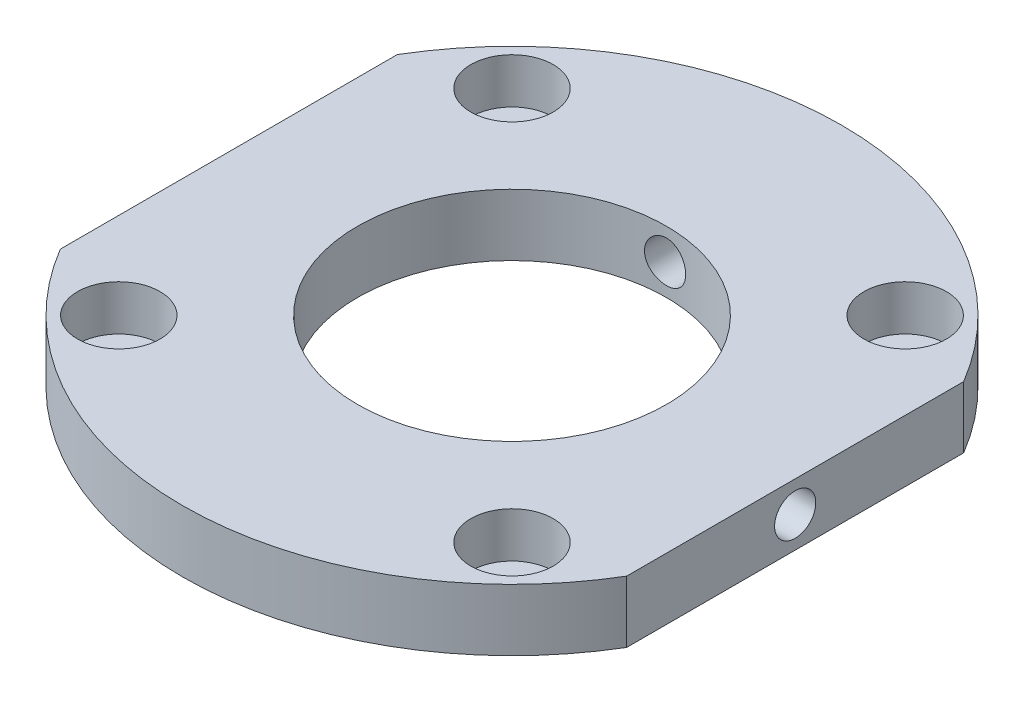
ISO-10303-21;
HEADER;
FILE_DESCRIPTION(('STEP AP214'),'2;1');
FILE_NAME('part.step','',(''),(''),'','','');
FILE_SCHEMA(('AUTOMOTIVE_DESIGN { 1 0 10303 214 1 1 1 1 }'));
ENDSEC;
DATA;
#1=APPLICATION_CONTEXT('core data for automotive mechanical design processes');
#2=APPLICATION_PROTOCOL_DEFINITION('international standard','automotive_design',2000,#1);
#3=PRODUCT_CONTEXT('',#1,'mechanical');
#4=PRODUCT('Part','Part','',(#3));
#5=PRODUCT_RELATED_PRODUCT_CATEGORY('part','',(#4));
#6=PRODUCT_DEFINITION_FORMATION('','',#4);
#7=PRODUCT_DEFINITION_CONTEXT('part definition',#1,'design');
#8=PRODUCT_DEFINITION('design','',#6,#7);
#9=PRODUCT_DEFINITION_SHAPE('','',#8);
#10=(LENGTH_UNIT() NAMED_UNIT(*) SI_UNIT(.MILLI.,.METRE.));
#11=(NAMED_UNIT(*) PLANE_ANGLE_UNIT() SI_UNIT($,.RADIAN.));
#12=(NAMED_UNIT(*) SI_UNIT($,.STERADIAN.) SOLID_ANGLE_UNIT());
#13=UNCERTAINTY_MEASURE_WITH_UNIT(LENGTH_MEASURE(1.E-05),#10,'distance_accuracy_value','');
#14=(GEOMETRIC_REPRESENTATION_CONTEXT(3) GLOBAL_UNCERTAINTY_ASSIGNED_CONTEXT((#13)) GLOBAL_UNIT_ASSIGNED_CONTEXT((#10,
#11,#12)) REPRESENTATION_CONTEXT('',''));
#15=CARTESIAN_POINT('',(0.,0.,0.));
#16=DIRECTION('',(0.,0.,1.));
#17=DIRECTION('',(1.,0.,0.));
#18=AXIS2_PLACEMENT_3D('',#15,#16,#17);
#19=CARTESIAN_POINT('',(0.,6.,0.));
#20=DIRECTION('',(0.,-1.,0.));
#21=DIRECTION('',(0.,0.,-1.));
#22=AXIS2_PLACEMENT_3D('',#19,#20,#21);
#23=CYLINDRICAL_SURFACE('',#22,32.);
#24=CARTESIAN_POINT('',(0.,5.,-32.));
#25=CARTESIAN_POINT('',(-0.112223346836729,4.99999506217715,-31.9999991691436));
#26=CARTESIAN_POINT('',(-0.224525271712995,4.99052270052992,-31.9994033390944));
#27=CARTESIAN_POINT('',(-0.446028210718385,4.95287153229503,-31.9970837372355));
#28=CARTESIAN_POINT('',(-0.555225461224794,4.92467095309709,-31.995358652637));
#29=CARTESIAN_POINT('',(-0.76727850818779,4.85037649827136,-31.9909756950359));
#30=CARTESIAN_POINT('',(-0.870137616661279,4.80429206138817,-31.9883183141517));
#31=CARTESIAN_POINT('',(-1.06663341580873,4.69555335911499,-31.9823696449571));
#32=CARTESIAN_POINT('',(-1.16027221185357,4.63290288851908,-31.97907850187));
#33=CARTESIAN_POINT('',(-1.33583645868492,4.49270769581982,-31.9722267354338));
#34=CARTESIAN_POINT('',(-1.41774628048157,4.41514341727255,-31.9686657620133));
#35=CARTESIAN_POINT('',(-1.56739381033953,4.2473626650146,-31.9616786657649));
#36=CARTESIAN_POINT('',(-1.63513092619535,4.15714566287376,-31.9582525485769));
#37=CARTESIAN_POINT('',(-1.75455837247395,3.96653191769914,-31.9519188366027));
#38=CARTESIAN_POINT('',(-1.80623572151365,3.8661270261233,-31.9490116620903));
#39=CARTESIAN_POINT('',(-1.89199363600726,3.65804475526381,-31.9440482085556));
#40=CARTESIAN_POINT('',(-1.92607439070512,3.55036745420595,-31.9419919203822));
#41=CARTESIAN_POINT('',(-1.97562831743006,3.33094747213823,-31.9389654609923));
#42=CARTESIAN_POINT('',(-1.99112596908517,3.21921033964478,-31.9379938610264));
#43=CARTESIAN_POINT('',(-2.0031493359497,2.99471672174316,-31.9372420665942));
#44=CARTESIAN_POINT('',(-1.99967526602792,2.88196024789422,-31.9374618586344));
#45=CARTESIAN_POINT('',(-1.97387412170284,2.65879549518035,-31.9390667357904));
#46=CARTESIAN_POINT('',(-1.95157353844043,2.5483841401366,-31.9404501834944));
#47=CARTESIAN_POINT('',(-1.88879348852425,2.33287500595443,-31.9442238871793));
#48=CARTESIAN_POINT('',(-1.84831391294731,2.22777725865777,-31.9466141491928));
#49=CARTESIAN_POINT('',(-1.75029487225467,2.02579357945255,-31.9521339981319));
#50=CARTESIAN_POINT('',(-1.6927433900599,1.92891349401527,-31.9552641055254));
#51=CARTESIAN_POINT('',(-1.56222292166933,1.74617912943944,-31.9619103808454));
#52=CARTESIAN_POINT('',(-1.48925376214584,1.6603249742734,-31.9654265531119));
#53=CARTESIAN_POINT('',(-1.32982006299893,1.50192542352285,-31.9724559793486));
#54=CARTESIAN_POINT('',(-1.24333259667533,1.42940310163137,-31.9759692179758));
#55=CARTESIAN_POINT('',(-1.05939772122561,1.29990383985337,-31.982591062014));
#56=CARTESIAN_POINT('',(-0.961950308270381,1.24292690539803,-31.9856996672838));
#57=CARTESIAN_POINT('',(-0.758847722758267,1.14613773981916,-31.9911621980439));
#58=CARTESIAN_POINT('',(-0.65319213264681,1.10632638259385,-31.99351608511));
#59=CARTESIAN_POINT('',(-0.436678621420558,1.04501388453335,-31.9972034118695));
#60=CARTESIAN_POINT('',(-0.325820761078034,1.02351252985915,-31.9985368634802));
#61=CARTESIAN_POINT('',(-0.102249754998165,0.999458972764364,-32.0000315242478));
#62=CARTESIAN_POINT('',(0.0104599459167998,0.996874868906477,-32.0001947068988));
#63=CARTESIAN_POINT('',(0.234711212096938,1.01064581326616,-31.9993356906232));
#64=CARTESIAN_POINT('',(0.346252783437985,1.02700076292529,-31.9983134978653));
#65=CARTESIAN_POINT('',(0.56491166220611,1.07815914272686,-31.9952000745992));
#66=CARTESIAN_POINT('',(0.672032407107905,1.1129479365225,-31.9931096922732));
#67=CARTESIAN_POINT('',(0.878914962577338,1.19997161189095,-31.9880950655264));
#68=CARTESIAN_POINT('',(0.978676706947324,1.25220665037752,-31.9851708136059));
#69=CARTESIAN_POINT('',(1.16815547641269,1.37272126166581,-31.9788121113869));
#70=CARTESIAN_POINT('',(1.25785892714608,1.44102214056318,-31.9753769858254));
#71=CARTESIAN_POINT('',(1.4245381064233,1.59169860828726,-31.9683853852037));
#72=CARTESIAN_POINT('',(1.5015137096365,1.67407433569224,-31.964828908949));
#73=CARTESIAN_POINT('',(1.64066020097159,1.85069978791836,-31.9579897332692));
#74=CARTESIAN_POINT('',(1.70281039277817,1.94496583442934,-31.9547074206804));
#75=CARTESIAN_POINT('',(1.81040027298452,2.14261401874783,-31.9487928812005));
#76=CARTESIAN_POINT('',(1.85584006443136,2.24599610033514,-31.9461606503005));
#77=CARTESIAN_POINT('',(1.92868343817412,2.45886612127191,-31.9418459068394));
#78=CARTESIAN_POINT('',(1.95610004685244,2.56834958857983,-31.9401627084838));
#79=CARTESIAN_POINT('',(1.99216134169379,2.79037667289578,-31.9379339446621));
#80=CARTESIAN_POINT('',(2.00080621416729,2.90292025952074,-31.937388367905));
#81=CARTESIAN_POINT('',(1.99907684048124,3.12766708327775,-31.9374966460887));
#82=CARTESIAN_POINT('',(1.98873513251053,3.23987057322256,-31.9381484490252));
#83=CARTESIAN_POINT('',(1.9493936205426,3.46094461238382,-31.9405736886462));
#84=CARTESIAN_POINT('',(1.92039378273976,3.56981515556111,-31.9423471273629));
#85=CARTESIAN_POINT('',(1.84456652625291,3.78113779391818,-31.946815285928));
#86=CARTESIAN_POINT('',(1.79773923559249,3.88358993518402,-31.9495099991605));
#87=CARTESIAN_POINT('',(1.68759082343583,4.07918218089061,-31.9555169893406));
#88=CARTESIAN_POINT('',(1.62427012917213,4.17232252645054,-31.9588292502911));
#89=CARTESIAN_POINT('',(1.48281211963383,4.34681223237425,-31.9657046929993));
#90=CARTESIAN_POINT('',(1.40465129170038,4.42814251505538,-31.9692682672274));
#91=CARTESIAN_POINT('',(1.23576309808775,4.57655578094688,-31.976241440984));
#92=CARTESIAN_POINT('',(1.14503266246553,4.64363527343915,-31.9796510026267));
#93=CARTESIAN_POINT('',(0.95347744973205,4.76169222059214,-31.9859354897034));
#94=CARTESIAN_POINT('',(0.852640322525288,4.81264965071681,-31.9888097484528));
#95=CARTESIAN_POINT('',(0.643897015514739,4.89684843464142,-31.9936907974328));
#96=CARTESIAN_POINT('',(0.535999282102363,4.93011053697395,-31.9956986030929));
#97=CARTESIAN_POINT('',(0.356201216456018,4.96932944872111,-31.9980943626532));
#98=CARTESIAN_POINT('',(0.2854630794237,4.98081603299553,-31.9988058007412));
#99=CARTESIAN_POINT('',(0.143160621752727,4.99615287847334,-31.9997588841249));
#100=CARTESIAN_POINT('',(0.0715963022564653,5.00000315023449,-32.0000005300701));
#101=CARTESIAN_POINT('',(0.,5.,-32.));
#102=B_SPLINE_CURVE_WITH_KNOTS('',3,(#24,#25,#26,#27,#28,#29,#30,#31,#32,#33,#34,#35,#36,#37,
#38,#39,#40,#41,#42,#43,#44,#45,#46,#47,#48,#49,#50,#51,#52,#53,#54,#55,#56,#57,#58,#59,#60,#61,
#62,#63,#64,#65,#66,#67,#68,#69,#70,#71,#72,#73,#74,#75,#76,#77,#78,#79,#80,#81,#82,#83,#84,#85,
#86,#87,#88,#89,#90,#91,#92,#93,#94,#95,#96,#97,#98,#99,#100,#101),.UNSPECIFIED.,.T.,.F.,(4,2,2,
2,2,2,2,2,2,2,2,2,2,2,2,2,2,2,2,2,2,2,2,2,2,2,2,2,2,2,2,2,2,2,2,2,2,2,4),(0.,0.336408671473624,
0.673209123258165,1.00983205968328,1.34637795233539,1.68336820424855,2.02037253446431,
2.35764856671476,2.6949209716279,3.03174859585641,3.36857240527032,3.70492305202053,
4.04127571411158,4.37786570218283,4.71445947444747,5.05163042223775,5.38880148782714,
5.72598971674317,6.06317400764855,6.39978955065089,6.73640334192087,7.07275026373908,
7.40910021078634,7.7458987565046,8.08270061846787,8.41996994064655,8.75723718297113,
9.09426039422936,9.43128026049925,9.76772309914687,10.1041665473784,10.4406075795674,
10.7770398977113,11.1140097747179,11.451062097263,11.7885314296162,12.1256041876343,
12.3402266427971,12.5548488012287),.UNSPECIFIED.);
#103=CARTESIAN_POINT('',(0.,5.,-32.));
#104=VERTEX_POINT('',#103);
#105=EDGE_CURVE('E130',#104,#104,#102,.T.);
#106=ORIENTED_EDGE('',*,*,#105,.T.);
#107=EDGE_LOOP('',(#106));
#108=FACE_BOUND('',#107,.T.);
#109=CARTESIAN_POINT('',(0.,6.,0.));
#110=DIRECTION('',(0.,1.,0.));
#111=DIRECTION('',(0.,0.,1.));
#112=AXIS2_PLACEMENT_3D('',#109,#110,#111);
#113=CIRCLE('',#112,32.);
#114=CARTESIAN_POINT('',(27.5,6.,-16.3630681719536));
#115=VERTEX_POINT('',#114);
#116=CARTESIAN_POINT('',(-27.5,6.,-16.3630681719536));
#117=VERTEX_POINT('',#116);
#118=EDGE_CURVE('E43',#115,#117,#113,.T.);
#119=ORIENTED_EDGE('',*,*,#118,.F.);
#120=DIRECTION('',(0.,1.,0.));
#121=VECTOR('',#120,1.);
#122=CARTESIAN_POINT('',(27.5,-4.,-16.3630681719536));
#123=LINE('',#122,#121);
#124=CARTESIAN_POINT('',(27.5,0.,-16.3630681719536));
#125=VERTEX_POINT('',#124);
#126=EDGE_CURVE('E73',#125,#115,#123,.T.);
#127=ORIENTED_EDGE('',*,*,#126,.F.);
#128=CARTESIAN_POINT('',(0.,0.,0.));
#129=DIRECTION('',(0.,1.,0.));
#130=DIRECTION('',(0.,0.,1.));
#131=AXIS2_PLACEMENT_3D('',#128,#129,#130);
#132=CIRCLE('',#131,32.);
#133=CARTESIAN_POINT('',(-27.5,0.,-16.3630681719536));
#134=VERTEX_POINT('',#133);
#135=EDGE_CURVE('E93',#125,#134,#132,.T.);
#136=ORIENTED_EDGE('',*,*,#135,.T.);
#137=DIRECTION('',(0.,1.,0.));
#138=VECTOR('',#137,1.);
#139=CARTESIAN_POINT('',(-27.5,-4.,-16.3630681719536));
#140=LINE('',#139,#138);
#141=EDGE_CURVE('E50',#134,#117,#140,.T.);
#142=ORIENTED_EDGE('',*,*,#141,.T.);
#143=EDGE_LOOP('',(#119,#127,#136,#142));
#144=FACE_BOUND('',#143,.T.);
#145=ADVANCED_FACE('F34',(#108,#144),#23,.T.);
#146=CARTESIAN_POINT('',(-27.5,0.,16.3630681719536));
#147=VERTEX_POINT('',#146);
#148=CARTESIAN_POINT('',(27.5,0.,16.3630681719536));
#149=VERTEX_POINT('',#148);
#150=EDGE_CURVE('E98',#147,#149,#132,.T.);
#151=ORIENTED_EDGE('',*,*,#150,.T.);
#152=DIRECTION('',(0.,1.,0.));
#153=VECTOR('',#152,1.);
#154=CARTESIAN_POINT('',(27.5,-4.,16.3630681719536));
#155=LINE('',#154,#153);
#156=CARTESIAN_POINT('',(27.5,6.,16.3630681719536));
#157=VERTEX_POINT('',#156);
#158=EDGE_CURVE('E57',#149,#157,#155,.T.);
#159=ORIENTED_EDGE('',*,*,#158,.T.);
#160=CARTESIAN_POINT('',(-27.5,6.,16.3630681719536));
#161=VERTEX_POINT('',#160);
#162=EDGE_CURVE('E90',#161,#157,#113,.T.);
#163=ORIENTED_EDGE('',*,*,#162,.F.);
#164=DIRECTION('',(0.,1.,0.));
#165=VECTOR('',#164,1.);
#166=CARTESIAN_POINT('',(-27.5,-4.,16.3630681719536));
#167=LINE('',#166,#165);
#168=EDGE_CURVE('E278',#147,#161,#167,.T.);
#169=ORIENTED_EDGE('',*,*,#168,.F.);
#170=EDGE_LOOP('',(#151,#159,#163,#169));
#171=FACE_BOUND('',#170,.T.);
#172=ADVANCED_FACE('F36',(#171),#23,.T.);
#173=CARTESIAN_POINT('',(0.,6.,0.));
#174=DIRECTION('',(0.,-1.,0.));
#175=DIRECTION('',(0.,0.,-1.));
#176=AXIS2_PLACEMENT_3D('',#173,#174,#175);
#177=CYLINDRICAL_SURFACE('',#176,15.);
#178=CARTESIAN_POINT('',(0.,5.,-15.));
#179=CARTESIAN_POINT('',(-0.111808835669284,4.99999529029309,-14.9999983574254));
#180=CARTESIAN_POINT('',(-0.22368597927628,4.99059246203753,-14.9987367072719));
#181=CARTESIAN_POINT('',(-0.444322725138079,4.95323365095044,-14.993825111269));
#182=CARTESIAN_POINT('',(-0.553079022333037,4.92525870510285,-14.9901727244172));
#183=CARTESIAN_POINT('',(-0.764248312626984,4.85159828245855,-14.9808907984907));
#184=CARTESIAN_POINT('',(-0.866665683058494,4.80592518896156,-14.9752626421097));
#185=CARTESIAN_POINT('',(-1.0623638950303,4.69819308619373,-14.9626538666039));
#186=CARTESIAN_POINT('',(-1.15564620633702,4.63613671883354,-14.9556734655857));
#187=CARTESIAN_POINT('',(-1.33102582250468,4.49698673839582,-14.9410899478996));
#188=CARTESIAN_POINT('',(-1.41305798549586,4.41981135499153,-14.9334835816211));
#189=CARTESIAN_POINT('',(-1.56304735673102,4.25278981092335,-14.9185313755795));
#190=CARTESIAN_POINT('',(-1.63100381997221,4.16294298000419,-14.9111855496234));
#191=CARTESIAN_POINT('',(-1.75115902268907,3.97270087705497,-14.8975543544019));
#192=CARTESIAN_POINT('',(-1.80329607482578,3.87226631752138,-14.8912731776576));
#193=CARTESIAN_POINT('',(-1.8899384500729,3.66396893276322,-14.8805258737923));
#194=CARTESIAN_POINT('',(-1.92444453245278,3.55610642764669,-14.8760596685121));
#195=CARTESIAN_POINT('',(-1.97464606772174,3.33669418949835,-14.8694793656867));
#196=CARTESIAN_POINT('',(-1.99045204228506,3.22517016546708,-14.8673514537014));
#197=CARTESIAN_POINT('',(-2.00314680548117,3.00103382039405,-14.8656465160932));
#198=CARTESIAN_POINT('',(-2.00003645633601,2.8884215491891,-14.866069374204));
#199=CARTESIAN_POINT('',(-1.97507745939234,2.66607886997207,-14.8694055577299));
#200=CARTESIAN_POINT('',(-1.95335097531762,2.5563344701143,-14.8723026462234));
#201=CARTESIAN_POINT('',(-1.89196724634371,2.34206316323991,-14.8802355277475));
#202=CARTESIAN_POINT('',(-1.85230959261457,2.23753637524499,-14.8852713695413));
#203=CARTESIAN_POINT('',(-1.75605929143191,2.0362903652928,-14.8969326111103));
#204=CARTESIAN_POINT('',(-1.69941397913749,1.9395966288057,-14.903562941239));
#205=CARTESIAN_POINT('',(-1.57083393344289,1.75704091808234,-14.9176623621993));
#206=CARTESIAN_POINT('',(-1.49889840502385,1.67117950744583,-14.9251314966353));
#207=CARTESIAN_POINT('',(-1.34110490026362,1.51201698741811,-14.9401389923359));
#208=CARTESIAN_POINT('',(-1.25514170702645,1.43882015729767,-14.947677435412));
#209=CARTESIAN_POINT('',(-1.07209417013341,1.30787795507161,-14.9619192381826));
#210=CARTESIAN_POINT('',(-0.975009794442369,1.25013262747648,-14.9686225954715));
#211=CARTESIAN_POINT('',(-0.772392219730469,1.15173088230526,-14.9804439374358));
#212=CARTESIAN_POINT('',(-0.666855578841231,1.11108146895369,-14.9855612720896));
#213=CARTESIAN_POINT('',(-0.450370924336249,1.04811068102766,-14.9936282590407));
#214=CARTESIAN_POINT('',(-0.339423199542257,1.02578832936061,-14.9965780268993));
#215=CARTESIAN_POINT('',(-0.116166903325644,1.00024156722888,-14.9999624137686));
#216=CARTESIAN_POINT('',(-0.00387503454704261,0.996873598216516,-15.0004159384905));
#217=CARTESIAN_POINT('',(0.219671617218718,1.00895166412718,-14.9988079153852));
#218=CARTESIAN_POINT('',(0.330926425345664,1.02439724178236,-14.996746428686));
#219=CARTESIAN_POINT('',(0.548813715572938,1.07354465338398,-14.990351753581));
#220=CARTESIAN_POINT('',(0.655462016512044,1.10717756832215,-14.9860271430292));
#221=CARTESIAN_POINT('',(0.861605098793559,1.19167296593709,-14.9755900925429));
#222=CARTESIAN_POINT('',(0.961099607015637,1.24253610601325,-14.9694775843944));
#223=CARTESIAN_POINT('',(1.15074887861608,1.36039215558331,-14.9560983737007));
#224=CARTESIAN_POINT('',(1.2408458143966,1.42747736571334,-14.9488251504572));
#225=CARTESIAN_POINT('',(1.4085529469919,1.57574332922426,-14.9339572870998));
#226=CARTESIAN_POINT('',(1.48616257662378,1.65692472251644,-14.9263626324062));
#227=CARTESIAN_POINT('',(1.62720549423098,1.83171314263955,-14.9116490247351));
#228=CARTESIAN_POINT('',(1.69054327608938,1.92539756673816,-14.904533487753));
#229=CARTESIAN_POINT('',(1.80058351078814,2.12215941028093,-14.8916413300182));
#230=CARTESIAN_POINT('',(1.84728633510347,2.22523661991038,-14.8858646793678));
#231=CARTESIAN_POINT('',(1.92257836500746,2.4375572420277,-14.8763281178008));
#232=CARTESIAN_POINT('',(1.95122028846795,2.54678168521081,-14.872562342326));
#233=CARTESIAN_POINT('',(1.98974667143959,2.76854363212876,-14.8674574869829));
#234=CARTESIAN_POINT('',(1.99963213426782,2.88108095832444,-14.8661182773134));
#235=CARTESIAN_POINT('',(2.00034485806189,3.10532349085351,-14.8660223129545));
#236=CARTESIAN_POINT('',(1.99132219194493,3.21702824096424,-14.8672452228252));
#237=CARTESIAN_POINT('',(1.95479376686689,3.43731787510387,-14.872091838742));
#238=CARTESIAN_POINT('',(1.92728801483269,3.54590276030198,-14.8757155438883));
#239=CARTESIAN_POINT('',(1.85462310332207,3.75684368325159,-14.8849489027276));
#240=CARTESIAN_POINT('',(1.80947220819041,3.85920261111686,-14.890557626594));
#241=CARTESIAN_POINT('',(1.70281342759737,4.05491588382606,-14.9031304571282));
#242=CARTESIAN_POINT('',(1.64130522630429,4.14827005475605,-14.910094589966));
#243=CARTESIAN_POINT('',(1.50312448509508,4.32408964992841,-14.9246596718306));
#244=CARTESIAN_POINT('',(1.42634027226901,4.40646694775513,-14.9322650575408));
#245=CARTESIAN_POINT('',(1.26002169349824,4.55722321636155,-14.9472171900166));
#246=CARTESIAN_POINT('',(1.17048434072978,4.62559889875025,-14.9545638756898));
#247=CARTESIAN_POINT('',(0.980752987852823,4.74666713846652,-14.9682063513753));
#248=CARTESIAN_POINT('',(0.880514620743966,4.79929066655525,-14.9744974642689));
#249=CARTESIAN_POINT('',(0.672592409587329,4.88688059854508,-14.9852732065897));
#250=CARTESIAN_POINT('',(0.564916678969889,4.92186590862486,-14.9897597692431));
#251=CARTESIAN_POINT('',(0.380588408098418,4.96494800638518,-14.9953572174327));
#252=CARTESIAN_POINT('',(0.305091081955778,4.97807324352364,-14.9970896363507));
#253=CARTESIAN_POINT('',(0.153073171616111,4.99560081416548,-14.9994115849077));
#254=CARTESIAN_POINT('',(0.0765525964512398,5.00000322461361,-15.000001124628));
#255=CARTESIAN_POINT('',(0.,5.,-15.));
#256=B_SPLINE_CURVE_WITH_KNOTS('',3,(#178,#179,#180,#181,#182,#183,#184,#185,#186,#187,#188,
#189,#190,#191,#192,#193,#194,#195,#196,#197,#198,#199,#200,#201,#202,#203,#204,#205,#206,#207,
#208,#209,#210,#211,#212,#213,#214,#215,#216,#217,#218,#219,#220,#221,#222,#223,#224,#225,#226,
#227,#228,#229,#230,#231,#232,#233,#234,#235,#236,#237,#238,#239,#240,#241,#242,#243,#244,#245,
#246,#247,#248,#249,#250,#251,#252,#253,#254,#255),.UNSPECIFIED.,.T.,.F.,(4,2,2,2,2,2,2,2,2,2,2,
2,2,2,2,2,2,2,2,2,2,2,2,2,2,2,2,2,2,2,2,2,2,2,2,2,2,2,4),(0.,0.335146851305743,
0.670636430885044,1.0058916928274,1.34109292564035,1.67815978443559,2.01524447904836,
2.35362721511647,2.69199537766205,3.02835355914359,3.3646964092492,3.69884885098043,
4.0330089117585,4.36821583137898,4.70344018443797,5.04130544484849,5.37917167852296,
5.71717620202539,6.05516270391743,6.39058584992061,6.72600084354478,7.06015363396463,
7.39431917503546,7.73043274769884,8.06656158258761,8.4048770453545,8.74318495273048,
9.08050074735454,9.41779849783634,9.75242927496624,10.0870599266875,10.4215340370262,
10.756014605959,11.0930366783511,11.4301378125116,11.7686952667452,12.1068890499242,
12.3363573904731,12.5658237068544),.UNSPECIFIED.);
#257=CARTESIAN_POINT('',(0.,5.,-15.));
#258=VERTEX_POINT('',#257);
#259=EDGE_CURVE('E131',#258,#258,#256,.T.);
#260=ORIENTED_EDGE('',*,*,#259,.F.);
#261=EDGE_LOOP('',(#260));
#262=FACE_BOUND('',#261,.T.);
#263=CARTESIAN_POINT('',(0.,0.,0.));
#264=DIRECTION('',(0.,1.,0.));
#265=DIRECTION('',(0.,0.,1.));
#266=AXIS2_PLACEMENT_3D('',#263,#264,#265);
#267=CIRCLE('',#266,15.);
#268=CARTESIAN_POINT('',(0.,0.,15.));
#269=VERTEX_POINT('',#268);
#270=EDGE_CURVE('E96',#269,#269,#267,.T.);
#271=ORIENTED_EDGE('',*,*,#270,.F.);
#272=EDGE_LOOP('',(#271));
#273=FACE_BOUND('',#272,.T.);
#274=CARTESIAN_POINT('',(0.,6.,0.));
#275=DIRECTION('',(0.,1.,0.));
#276=DIRECTION('',(0.,0.,1.));
#277=AXIS2_PLACEMENT_3D('',#274,#275,#276);
#278=CIRCLE('',#277,15.);
#279=CARTESIAN_POINT('',(0.,6.,15.));
#280=VERTEX_POINT('',#279);
#281=EDGE_CURVE('E101',#280,#280,#278,.T.);
#282=ORIENTED_EDGE('',*,*,#281,.T.);
#283=EDGE_LOOP('',(#282));
#284=FACE_BOUND('',#283,.T.);
#285=CARTESIAN_POINT('',(14.8660687473185,3.,2.));
#286=CARTESIAN_POINT('',(14.8660704451043,2.88819614453247,1.99999528594759));
#287=CARTESIAN_POINT('',(14.8673436464034,2.77632396688378,1.99059326704128));
#288=CARTESIAN_POINT('',(14.8722964859732,2.55569753766411,1.9532379626613));
#289=CARTESIAN_POINT('',(14.8759785863295,2.4469465950828,1.92526569649113));
#290=CARTESIAN_POINT('',(14.8853249214529,2.23578863177368,1.85161311140264));
#291=CARTESIAN_POINT('',(14.8909877556206,2.13337718838231,1.80594530275044));
#292=CARTESIAN_POINT('',(14.9036558225185,1.93768892429044,1.69822564880686));
#293=CARTESIAN_POINT('',(14.9106608397868,1.84441064106197,1.63617643263469));
#294=CARTESIAN_POINT('',(14.9252737732073,1.66902654533153,1.49703370489518));
#295=CARTESIAN_POINT('',(14.9328848849373,1.58698713432062,1.41985682274859));
#296=CARTESIAN_POINT('',(14.9478237625824,1.43698375454362,1.2528292287261));
#297=CARTESIAN_POINT('',(14.9551515139324,1.3690205085238,1.16297786647198));
#298=CARTESIAN_POINT('',(14.9687309976037,1.2488581582836,0.972731724927611));
#299=CARTESIAN_POINT('',(14.9749785650228,1.19671951070975,0.872298437711221));
#300=CARTESIAN_POINT('',(14.9856585341581,1.1100738358192,0.664003816037366));
#301=CARTESIAN_POINT('',(14.990091012146,1.07556606762232,0.556142793922399));
#302=CARTESIAN_POINT('',(14.9966188619561,1.02536109041973,0.336735375014088));
#303=CARTESIAN_POINT('',(14.9987279820508,1.00955318498804,0.225214723469897));
#304=CARTESIAN_POINT('',(15.0004184797152,0.996853391263178,0.00108500230365571));
#305=CARTESIAN_POINT('',(14.9999999696283,0.999960662263482,-0.111524018722467));
#306=CARTESIAN_POINT('',(14.9966934411691,1.02491473054095,-0.33388012446577));
#307=CARTESIAN_POINT('',(14.9938211133781,1.04664246474565,-0.443640837361785));
#308=CARTESIAN_POINT('',(14.9859472409229,1.10803432702151,-0.657944122712555));
#309=CARTESIAN_POINT('',(14.9809456511403,1.14769883516811,-0.76248658454184));
#310=CARTESIAN_POINT('',(14.9693481900416,1.24396344112182,-0.963751808424129));
#311=CARTESIAN_POINT('',(14.9627475214588,1.30061462318308,-1.06044984935326));
#312=CARTESIAN_POINT('',(14.9486895041904,1.42920725728286,-1.24301169073479));
#313=CARTESIAN_POINT('',(14.9412321108429,1.5011495066278,-1.32887492586682));
#314=CARTESIAN_POINT('',(14.9262258809566,1.65894784835893,-1.48803006154539));
#315=CARTESIAN_POINT('',(14.918676784244,1.74490776819363,-1.56121903353021));
#316=CARTESIAN_POINT('',(14.9043949876924,1.92794593137257,-1.69214693057191));
#317=CARTESIAN_POINT('',(14.8976622910907,2.02502421880297,-1.74988579436353));
#318=CARTESIAN_POINT('',(14.8857757633434,2.2276400003467,-1.848282860865));
#319=CARTESIAN_POINT('',(14.8806227621479,2.33318190451849,-1.88893208906707));
#320=CARTESIAN_POINT('',(14.8724947546572,2.54967802063838,-1.95190090044924));
#321=CARTESIAN_POINT('',(14.8695196283616,2.66063193402656,-1.97422149354143));
#322=CARTESIAN_POINT('',(14.8661064501035,2.88389133500496,-1.99976160768727));
#323=CARTESIAN_POINT('',(14.8656491151163,2.99617993033254,-2.00312631098812));
#324=CARTESIAN_POINT('',(14.867272242967,3.21971925610474,-1.99104288188796));
#325=CARTESIAN_POINT('',(14.8693526440475,3.33097001173945,-1.97559520729776));
#326=CARTESIAN_POINT('',(14.8757992043677,3.54883598640561,-1.9264480503702));
#327=CARTESIAN_POINT('',(14.8801564778765,3.6554674930181,-1.8928195032336));
#328=CARTESIAN_POINT('',(14.8906585901441,3.86157891345244,-1.80833845080125));
#329=CARTESIAN_POINT('',(14.8968034998284,3.96105854332372,-1.75748526209383));
#330=CARTESIAN_POINT('',(14.9102344661952,4.15069731044081,-1.63964406417211));
#331=CARTESIAN_POINT('',(14.9175271378913,4.24079704836824,-1.572561231663));
#332=CARTESIAN_POINT('',(14.9324114351651,4.40851093843709,-1.42429832312799));
#333=CARTESIAN_POINT('',(14.9400030739993,4.48612453614802,-1.34311762143754));
#334=CARTESIAN_POINT('',(14.9546894865533,4.62717655392112,-1.16832754835824));
#335=CARTESIAN_POINT('',(14.9617807004972,4.69051931637161,-1.07464064093252));
#336=CARTESIAN_POINT('',(14.974613414783,4.80056828217533,-0.877872452317619));
#337=CARTESIAN_POINT('',(14.9803549454849,4.84727485975611,-0.774791382513699));
#338=CARTESIAN_POINT('',(14.9898256469115,4.92256926158813,-0.562472772523433));
#339=CARTESIAN_POINT('',(14.9935608482078,4.95121142908355,-0.453254784247362));
#340=CARTESIAN_POINT('',(14.9986231668662,4.98974048546098,-0.231506493423198));
#341=CARTESIAN_POINT('',(14.9999504085613,4.99962834270771,-0.118976362199823));
#342=CARTESIAN_POINT('',(15.0000464724842,5.00034826724032,0.10526987371159));
#343=CARTESIAN_POINT('',(14.9988350491343,4.99132747059439,0.216985525921881));
#344=CARTESIAN_POINT('',(14.9940293321986,4.95479895876802,0.437297443052354));
#345=CARTESIAN_POINT('',(14.9904350419501,4.9272912694787,0.545893712341048));
#346=CARTESIAN_POINT('',(14.9812655664247,4.85461795292333,0.756858234588861));
#347=CARTESIAN_POINT('',(14.9756912840831,4.80946037359194,0.859229301543912));
#348=CARTESIAN_POINT('',(14.9631774939599,4.70278445035426,1.05496407863088));
#349=CARTESIAN_POINT('',(14.95623796097,4.64126580434756,1.14832762239917));
#350=CARTESIAN_POINT('',(14.9417029120984,4.50307331799635,1.32414728606674));
#351=CARTESIAN_POINT('',(14.9341029029987,4.4262902098608,1.406517157164));
#352=CARTESIAN_POINT('',(14.919138648968,4.25997693095264,1.55725895587216));
#353=CARTESIAN_POINT('',(14.9117744601021,4.17044375607874,1.62562757530232));
#354=CARTESIAN_POINT('',(14.8980810988492,3.98071605842911,1.74668790978495));
#355=CARTESIAN_POINT('',(14.8917566176026,3.8804764084899,1.79930940429126));
#356=CARTESIAN_POINT('',(14.8809136658427,3.67255153248295,1.8868951828149));
#357=CARTESIAN_POINT('',(14.8763932602426,3.56487443024063,1.92187839666366));
#358=CARTESIAN_POINT('',(14.8707513382361,3.38055172127446,1.96495480378583));
#359=CARTESIAN_POINT('',(14.8690042861798,3.30506172703186,1.97807748135802));
#360=CARTESIAN_POINT('',(14.866662414787,3.1530584905295,1.99560165343181));
#361=CARTESIAN_POINT('',(14.8660675849485,3.07654525760259,2.00000322742319));
#362=CARTESIAN_POINT('',(14.8660687473185,3.,2.));
#363=B_SPLINE_CURVE_WITH_KNOTS('',3,(#285,#286,#287,#288,#289,#290,#291,#292,#293,#294,#295,
#296,#297,#298,#299,#300,#301,#302,#303,#304,#305,#306,#307,#308,#309,#310,#311,#312,#313,#314,
#315,#316,#317,#318,#319,#320,#321,#322,#323,#324,#325,#326,#327,#328,#329,#330,#331,#332,#333,
#334,#335,#336,#337,#338,#339,#340,#341,#342,#343,#344,#345,#346,#347,#348,#349,#350,#351,#352,
#353,#354,#355,#356,#357,#358,#359,#360,#361,#362),.UNSPECIFIED.,.T.,.F.,(4,2,2,2,2,2,2,2,2,2,2,
2,2,2,2,2,2,2,2,2,2,2,2,2,2,2,2,2,2,2,2,2,2,2,2,2,2,2,4),(0.,0.335131889250449,
0.670606846105683,1.00584506276825,1.34102950834956,1.67811595121165,2.01521969762238,
2.35359556525147,2.69195721256928,3.02830569524969,3.36463922864856,3.69883808669953,
4.03304402666679,4.36826528456251,4.70350402584628,5.04134915068959,5.37919561519091,
5.71721927655741,6.05522431149102,6.3906370258193,6.72604157783542,7.06014684818595,
7.3942653761821,7.73038528142333,8.06652010750621,8.40484511764504,8.74316251675152,
9.08045723770335,9.41773454222147,9.752397098563,10.0870591862064,10.4215688535019,
10.7560846978108,11.0930874236894,11.430169684094,11.768733419821,12.1069330231324,
12.3363794094425,12.5658237044201),.UNSPECIFIED.);
#364=CARTESIAN_POINT('',(14.8660687473185,3.,2.));
#365=VERTEX_POINT('',#364);
#366=EDGE_CURVE('E121',#365,#365,#363,.T.);
#367=ORIENTED_EDGE('',*,*,#366,.T.);
#368=EDGE_LOOP('',(#367));
#369=FACE_BOUND('',#368,.T.);
#370=ADVANCED_FACE('F136',(#262,#273,#284,#369),#177,.F.);
#371=CARTESIAN_POINT('',(0.,6.,0.));
#372=DIRECTION('',(0.,1.,0.));
#373=DIRECTION('',(0.,0.,1.));
#374=AXIS2_PLACEMENT_3D('',#371,#372,#373);
#375=PLANE('',#374);
#376=DIRECTION('',(0.,0.,1.));
#377=VECTOR('',#376,1.);
#378=CARTESIAN_POINT('',(27.5,6.,16.3630681719536));
#379=LINE('',#378,#377);
#380=EDGE_CURVE('E76',#115,#157,#379,.T.);
#381=ORIENTED_EDGE('',*,*,#380,.F.);
#382=ORIENTED_EDGE('',*,*,#118,.T.);
#383=DIRECTION('',(0.,0.,-1.));
#384=VECTOR('',#383,1.);
#385=CARTESIAN_POINT('',(-27.5,6.,-16.3630681719536));
#386=LINE('',#385,#384);
#387=EDGE_CURVE('E276',#161,#117,#386,.T.);
#388=ORIENTED_EDGE('',*,*,#387,.F.);
#389=ORIENTED_EDGE('',*,*,#162,.T.);
#390=EDGE_LOOP('',(#381,#382,#388,#389));
#391=FACE_BOUND('',#390,.T.);
#392=CARTESIAN_POINT('',(19.0918830920368,6.,-19.0918830920367));
#393=DIRECTION('',(0.,1.,0.));
#394=DIRECTION('',(0.,0.,1.));
#395=AXIS2_PLACEMENT_3D('',#392,#393,#394);
#396=CIRCLE('',#395,4.);
#397=CARTESIAN_POINT('',(19.0918830920368,6.,-15.0918830920367));
#398=VERTEX_POINT('',#397);
#399=EDGE_CURVE('E129',#398,#398,#396,.T.);
#400=ORIENTED_EDGE('',*,*,#399,.F.);
#401=EDGE_LOOP('',(#400));
#402=FACE_BOUND('',#401,.T.);
#403=CARTESIAN_POINT('',(19.0918830920375,6.,19.0918830920361));
#404=DIRECTION('',(0.,1.,0.));
#405=DIRECTION('',(0.,0.,1.));
#406=AXIS2_PLACEMENT_3D('',#403,#404,#405);
#407=CIRCLE('',#406,4.);
#408=CARTESIAN_POINT('',(19.0918830920375,6.,23.0918830920361));
#409=VERTEX_POINT('',#408);
#410=EDGE_CURVE('E119',#409,#409,#407,.T.);
#411=ORIENTED_EDGE('',*,*,#410,.F.);
#412=EDGE_LOOP('',(#411));
#413=FACE_BOUND('',#412,.T.);
#414=CARTESIAN_POINT('',(-19.0918830920354,6.,19.0918830920367));
#415=DIRECTION('',(0.,1.,0.));
#416=DIRECTION('',(0.,0.,1.));
#417=AXIS2_PLACEMENT_3D('',#414,#415,#416);
#418=CIRCLE('',#417,4.);
#419=CARTESIAN_POINT('',(-19.0918830920354,6.,23.0918830920367));
#420=VERTEX_POINT('',#419);
#421=EDGE_CURVE('E114',#420,#420,#418,.T.);
#422=ORIENTED_EDGE('',*,*,#421,.F.);
#423=EDGE_LOOP('',(#422));
#424=FACE_BOUND('',#423,.T.);
#425=CARTESIAN_POINT('',(-19.091883092036,6.,-19.0918830920361));
#426=DIRECTION('',(0.,1.,0.));
#427=DIRECTION('',(0.,0.,1.));
#428=AXIS2_PLACEMENT_3D('',#425,#426,#427);
#429=CIRCLE('',#428,4.);
#430=CARTESIAN_POINT('',(-19.091883092036,6.,-15.0918830920361));
#431=VERTEX_POINT('',#430);
#432=EDGE_CURVE('E109',#431,#431,#429,.T.);
#433=ORIENTED_EDGE('',*,*,#432,.F.);
#434=EDGE_LOOP('',(#433));
#435=FACE_BOUND('',#434,.T.);
#436=ORIENTED_EDGE('',*,*,#281,.F.);
#437=EDGE_LOOP('',(#436));
#438=FACE_BOUND('',#437,.T.);
#439=ADVANCED_FACE('F86',(#391,#402,#413,#424,#435,#438),#375,.T.);
#440=CARTESIAN_POINT('',(0.,0.,0.));
#441=DIRECTION('',(0.,1.,0.));
#442=DIRECTION('',(0.,0.,1.));
#443=AXIS2_PLACEMENT_3D('',#440,#441,#442);
#444=PLANE('',#443);
#445=CARTESIAN_POINT('',(19.0918830920368,0.,-19.0918830920367));
#446=DIRECTION('',(0.,1.,0.));
#447=DIRECTION('',(0.,0.,1.));
#448=AXIS2_PLACEMENT_3D('',#445,#446,#447);
#449=CIRCLE('',#448,2.15);
#450=CARTESIAN_POINT('',(19.0918830920368,0.,-16.9418830920367));
#451=VERTEX_POINT('',#450);
#452=EDGE_CURVE('E116',#451,#451,#449,.T.);
#453=ORIENTED_EDGE('',*,*,#452,.T.);
#454=EDGE_LOOP('',(#453));
#455=FACE_BOUND('',#454,.T.);
#456=CARTESIAN_POINT('',(19.0918830920375,0.,19.0918830920361));
#457=DIRECTION('',(0.,1.,0.));
#458=DIRECTION('',(0.,0.,1.));
#459=AXIS2_PLACEMENT_3D('',#456,#457,#458);
#460=CIRCLE('',#459,2.15);
#461=CARTESIAN_POINT('',(19.0918830920375,0.,21.2418830920361));
#462=VERTEX_POINT('',#461);
#463=EDGE_CURVE('E111',#462,#462,#460,.T.);
#464=ORIENTED_EDGE('',*,*,#463,.T.);
#465=EDGE_LOOP('',(#464));
#466=FACE_BOUND('',#465,.T.);
#467=CARTESIAN_POINT('',(-19.0918830920354,0.,19.0918830920367));
#468=DIRECTION('',(0.,1.,0.));
#469=DIRECTION('',(0.,0.,1.));
#470=AXIS2_PLACEMENT_3D('',#467,#468,#469);
#471=CIRCLE('',#470,2.15);
#472=CARTESIAN_POINT('',(-19.0918830920354,0.,21.2418830920367));
#473=VERTEX_POINT('',#472);
#474=EDGE_CURVE('E106',#473,#473,#471,.T.);
#475=ORIENTED_EDGE('',*,*,#474,.T.);
#476=EDGE_LOOP('',(#475));
#477=FACE_BOUND('',#476,.T.);
#478=CARTESIAN_POINT('',(-19.091883092036,0.,-19.0918830920361));
#479=DIRECTION('',(0.,1.,0.));
#480=DIRECTION('',(0.,0.,1.));
#481=AXIS2_PLACEMENT_3D('',#478,#479,#480);
#482=CIRCLE('',#481,2.15);
#483=CARTESIAN_POINT('',(-19.091883092036,0.,-16.9418830920361));
#484=VERTEX_POINT('',#483);
#485=EDGE_CURVE('E102',#484,#484,#482,.T.);
#486=ORIENTED_EDGE('',*,*,#485,.T.);
#487=EDGE_LOOP('',(#486));
#488=FACE_BOUND('',#487,.T.);
#489=ORIENTED_EDGE('',*,*,#135,.F.);
#490=DIRECTION('',(0.,0.,1.));
#491=VECTOR('',#490,1.);
#492=CARTESIAN_POINT('',(27.5,0.,0.));
#493=LINE('',#492,#491);
#494=EDGE_CURVE('E77',#125,#149,#493,.T.);
#495=ORIENTED_EDGE('',*,*,#494,.T.);
#496=ORIENTED_EDGE('',*,*,#150,.F.);
#497=DIRECTION('',(0.,0.,-1.));
#498=VECTOR('',#497,1.);
#499=CARTESIAN_POINT('',(-27.5,0.,0.));
#500=LINE('',#499,#498);
#501=EDGE_CURVE('E11',#147,#134,#500,.T.);
#502=ORIENTED_EDGE('',*,*,#501,.T.);
#503=EDGE_LOOP('',(#489,#495,#496,#502));
#504=FACE_BOUND('',#503,.T.);
#505=ORIENTED_EDGE('',*,*,#270,.T.);
#506=EDGE_LOOP('',(#505));
#507=FACE_BOUND('',#506,.T.);
#508=ADVANCED_FACE('F193',(#455,#466,#477,#488,#504,#507),#444,.F.);
#509=CARTESIAN_POINT('',(-19.091883092036,6.,-19.0918830920361));
#510=DIRECTION('',(0.,1.,0.));
#511=DIRECTION('',(0.,0.,1.));
#512=AXIS2_PLACEMENT_3D('',#509,#510,#511);
#513=CYLINDRICAL_SURFACE('',#512,2.15);
#514=CARTESIAN_POINT('',(-19.091883092036,1.6,-19.0918830920361));
#515=DIRECTION('',(0.,1.,0.));
#516=DIRECTION('',(0.,0.,1.));
#517=AXIS2_PLACEMENT_3D('',#514,#515,#516);
#518=CIRCLE('',#517,2.15);
#519=CARTESIAN_POINT('',(-19.091883092036,1.6,-16.9418830920361));
#520=VERTEX_POINT('',#519);
#521=EDGE_CURVE('E105',#520,#520,#518,.T.);
#522=ORIENTED_EDGE('',*,*,#521,.T.);
#523=EDGE_LOOP('',(#522));
#524=FACE_BOUND('',#523,.T.);
#525=ORIENTED_EDGE('',*,*,#485,.F.);
#526=EDGE_LOOP('',(#525));
#527=FACE_BOUND('',#526,.T.);
#528=ADVANCED_FACE('F190',(#524,#527),#513,.F.);
#529=CARTESIAN_POINT('',(-16.941883092036,1.6,-19.0918830920361));
#530=DIRECTION('',(0.,-1.,0.));
#531=DIRECTION('',(0.,0.,-1.));
#532=AXIS2_PLACEMENT_3D('',#529,#530,#531);
#533=PLANE('',#532);
#534=ORIENTED_EDGE('',*,*,#521,.F.);
#535=EDGE_LOOP('',(#534));
#536=FACE_BOUND('',#535,.T.);
#537=CARTESIAN_POINT('',(-19.091883092036,1.6,-19.0918830920361));
#538=DIRECTION('',(0.,1.,0.));
#539=DIRECTION('',(0.,0.,1.));
#540=AXIS2_PLACEMENT_3D('',#537,#538,#539);
#541=CIRCLE('',#540,4.);
#542=CARTESIAN_POINT('',(-19.091883092036,1.6,-15.0918830920361));
#543=VERTEX_POINT('',#542);
#544=EDGE_CURVE('E241',#543,#543,#541,.T.);
#545=ORIENTED_EDGE('',*,*,#544,.T.);
#546=EDGE_LOOP('',(#545));
#547=FACE_BOUND('',#546,.T.);
#548=ADVANCED_FACE('F187',(#536,#547),#533,.F.);
#549=CARTESIAN_POINT('',(-19.091883092036,6.,-19.0918830920361));
#550=DIRECTION('',(0.,1.,0.));
#551=DIRECTION('',(0.,0.,1.));
#552=AXIS2_PLACEMENT_3D('',#549,#550,#551);
#553=CYLINDRICAL_SURFACE('',#552,4.);
#554=ORIENTED_EDGE('',*,*,#544,.F.);
#555=EDGE_LOOP('',(#554));
#556=FACE_BOUND('',#555,.T.);
#557=ORIENTED_EDGE('',*,*,#432,.T.);
#558=EDGE_LOOP('',(#557));
#559=FACE_BOUND('',#558,.T.);
#560=ADVANCED_FACE('F183',(#556,#559),#553,.F.);
#561=CARTESIAN_POINT('',(-19.0918830920354,6.,19.0918830920367));
#562=DIRECTION('',(0.,1.,0.));
#563=DIRECTION('',(0.,0.,1.));
#564=AXIS2_PLACEMENT_3D('',#561,#562,#563);
#565=CYLINDRICAL_SURFACE('',#564,2.15);
#566=CARTESIAN_POINT('',(-19.0918830920354,1.6,19.0918830920367));
#567=DIRECTION('',(0.,1.,0.));
#568=DIRECTION('',(0.,0.,1.));
#569=AXIS2_PLACEMENT_3D('',#566,#567,#568);
#570=CIRCLE('',#569,2.15);
#571=CARTESIAN_POINT('',(-19.0918830920354,1.6,21.2418830920367));
#572=VERTEX_POINT('',#571);
#573=EDGE_CURVE('E110',#572,#572,#570,.T.);
#574=ORIENTED_EDGE('',*,*,#573,.T.);
#575=EDGE_LOOP('',(#574));
#576=FACE_BOUND('',#575,.T.);
#577=ORIENTED_EDGE('',*,*,#474,.F.);
#578=EDGE_LOOP('',(#577));
#579=FACE_BOUND('',#578,.T.);
#580=ADVANCED_FACE('F179',(#576,#579),#565,.F.);
#581=CARTESIAN_POINT('',(-16.9418830920354,1.6,19.0918830920367));
#582=DIRECTION('',(0.,-1.,0.));
#583=DIRECTION('',(0.,0.,-1.));
#584=AXIS2_PLACEMENT_3D('',#581,#582,#583);
#585=PLANE('',#584);
#586=ORIENTED_EDGE('',*,*,#573,.F.);
#587=EDGE_LOOP('',(#586));
#588=FACE_BOUND('',#587,.T.);
#589=CARTESIAN_POINT('',(-19.0918830920354,1.6,19.0918830920367));
#590=DIRECTION('',(0.,1.,0.));
#591=DIRECTION('',(0.,0.,1.));
#592=AXIS2_PLACEMENT_3D('',#589,#590,#591);
#593=CIRCLE('',#592,4.);
#594=CARTESIAN_POINT('',(-19.0918830920354,1.6,23.0918830920367));
#595=VERTEX_POINT('',#594);
#596=EDGE_CURVE('E234',#595,#595,#593,.T.);
#597=ORIENTED_EDGE('',*,*,#596,.T.);
#598=EDGE_LOOP('',(#597));
#599=FACE_BOUND('',#598,.T.);
#600=ADVANCED_FACE('F175',(#588,#599),#585,.F.);
#601=CARTESIAN_POINT('',(-19.0918830920354,6.,19.0918830920367));
#602=DIRECTION('',(0.,1.,0.));
#603=DIRECTION('',(0.,0.,1.));
#604=AXIS2_PLACEMENT_3D('',#601,#602,#603);
#605=CYLINDRICAL_SURFACE('',#604,4.);
#606=ORIENTED_EDGE('',*,*,#596,.F.);
#607=EDGE_LOOP('',(#606));
#608=FACE_BOUND('',#607,.T.);
#609=ORIENTED_EDGE('',*,*,#421,.T.);
#610=EDGE_LOOP('',(#609));
#611=FACE_BOUND('',#610,.T.);
#612=ADVANCED_FACE('F171',(#608,#611),#605,.F.);
#613=CARTESIAN_POINT('',(19.0918830920375,6.,19.0918830920361));
#614=DIRECTION('',(0.,1.,0.));
#615=DIRECTION('',(0.,0.,1.));
#616=AXIS2_PLACEMENT_3D('',#613,#614,#615);
#617=CYLINDRICAL_SURFACE('',#616,2.15);
#618=CARTESIAN_POINT('',(19.0918830920375,1.6,19.0918830920361));
#619=DIRECTION('',(0.,1.,0.));
#620=DIRECTION('',(0.,0.,1.));
#621=AXIS2_PLACEMENT_3D('',#618,#619,#620);
#622=CIRCLE('',#621,2.15);
#623=CARTESIAN_POINT('',(19.0918830920375,1.6,21.2418830920361));
#624=VERTEX_POINT('',#623);
#625=EDGE_CURVE('E115',#624,#624,#622,.T.);
#626=ORIENTED_EDGE('',*,*,#625,.T.);
#627=EDGE_LOOP('',(#626));
#628=FACE_BOUND('',#627,.T.);
#629=ORIENTED_EDGE('',*,*,#463,.F.);
#630=EDGE_LOOP('',(#629));
#631=FACE_BOUND('',#630,.T.);
#632=ADVANCED_FACE('F167',(#628,#631),#617,.F.);
#633=CARTESIAN_POINT('',(21.2418830920375,1.6,19.0918830920361));
#634=DIRECTION('',(0.,-1.,0.));
#635=DIRECTION('',(0.,0.,-1.));
#636=AXIS2_PLACEMENT_3D('',#633,#634,#635);
#637=PLANE('',#636);
#638=ORIENTED_EDGE('',*,*,#625,.F.);
#639=EDGE_LOOP('',(#638));
#640=FACE_BOUND('',#639,.T.);
#641=CARTESIAN_POINT('',(19.0918830920375,1.6,19.0918830920361));
#642=DIRECTION('',(0.,1.,0.));
#643=DIRECTION('',(0.,0.,1.));
#644=AXIS2_PLACEMENT_3D('',#641,#642,#643);
#645=CIRCLE('',#644,4.);
#646=CARTESIAN_POINT('',(19.0918830920375,1.6,23.0918830920361));
#647=VERTEX_POINT('',#646);
#648=EDGE_CURVE('E227',#647,#647,#645,.T.);
#649=ORIENTED_EDGE('',*,*,#648,.T.);
#650=EDGE_LOOP('',(#649));
#651=FACE_BOUND('',#650,.T.);
#652=ADVANCED_FACE('F163',(#640,#651),#637,.F.);
#653=CARTESIAN_POINT('',(19.0918830920375,6.,19.0918830920361));
#654=DIRECTION('',(0.,1.,0.));
#655=DIRECTION('',(0.,0.,1.));
#656=AXIS2_PLACEMENT_3D('',#653,#654,#655);
#657=CYLINDRICAL_SURFACE('',#656,4.);
#658=ORIENTED_EDGE('',*,*,#648,.F.);
#659=EDGE_LOOP('',(#658));
#660=FACE_BOUND('',#659,.T.);
#661=ORIENTED_EDGE('',*,*,#410,.T.);
#662=EDGE_LOOP('',(#661));
#663=FACE_BOUND('',#662,.T.);
#664=ADVANCED_FACE('F159',(#660,#663),#657,.F.);
#665=CARTESIAN_POINT('',(19.0918830920368,6.,-19.0918830920367));
#666=DIRECTION('',(0.,1.,0.));
#667=DIRECTION('',(0.,0.,1.));
#668=AXIS2_PLACEMENT_3D('',#665,#666,#667);
#669=CYLINDRICAL_SURFACE('',#668,2.15);
#670=CARTESIAN_POINT('',(19.0918830920368,1.6,-19.0918830920367));
#671=DIRECTION('',(0.,1.,0.));
#672=DIRECTION('',(0.,0.,1.));
#673=AXIS2_PLACEMENT_3D('',#670,#671,#672);
#674=CIRCLE('',#673,2.15);
#675=CARTESIAN_POINT('',(19.0918830920368,1.6,-16.9418830920367));
#676=VERTEX_POINT('',#675);
#677=EDGE_CURVE('E120',#676,#676,#674,.T.);
#678=ORIENTED_EDGE('',*,*,#677,.T.);
#679=EDGE_LOOP('',(#678));
#680=FACE_BOUND('',#679,.T.);
#681=ORIENTED_EDGE('',*,*,#452,.F.);
#682=EDGE_LOOP('',(#681));
#683=FACE_BOUND('',#682,.T.);
#684=ADVANCED_FACE('F155',(#680,#683),#669,.F.);
#685=CARTESIAN_POINT('',(21.2418830920368,1.6,-19.0918830920367));
#686=DIRECTION('',(0.,-1.,0.));
#687=DIRECTION('',(0.,0.,-1.));
#688=AXIS2_PLACEMENT_3D('',#685,#686,#687);
#689=PLANE('',#688);
#690=ORIENTED_EDGE('',*,*,#677,.F.);
#691=EDGE_LOOP('',(#690));
#692=FACE_BOUND('',#691,.T.);
#693=CARTESIAN_POINT('',(19.0918830920368,1.6,-19.0918830920367));
#694=DIRECTION('',(0.,1.,0.));
#695=DIRECTION('',(0.,0.,1.));
#696=AXIS2_PLACEMENT_3D('',#693,#694,#695);
#697=CIRCLE('',#696,4.);
#698=CARTESIAN_POINT('',(19.0918830920368,1.6,-15.0918830920368));
#699=VERTEX_POINT('',#698);
#700=EDGE_CURVE('E220',#699,#699,#697,.T.);
#701=ORIENTED_EDGE('',*,*,#700,.T.);
#702=EDGE_LOOP('',(#701));
#703=FACE_BOUND('',#702,.T.);
#704=ADVANCED_FACE('F151',(#692,#703),#689,.F.);
#705=CARTESIAN_POINT('',(19.0918830920368,6.,-19.0918830920367));
#706=DIRECTION('',(0.,1.,0.));
#707=DIRECTION('',(0.,0.,1.));
#708=AXIS2_PLACEMENT_3D('',#705,#706,#707);
#709=CYLINDRICAL_SURFACE('',#708,4.);
#710=ORIENTED_EDGE('',*,*,#700,.F.);
#711=EDGE_LOOP('',(#710));
#712=FACE_BOUND('',#711,.T.);
#713=ORIENTED_EDGE('',*,*,#399,.T.);
#714=EDGE_LOOP('',(#713));
#715=FACE_BOUND('',#714,.T.);
#716=ADVANCED_FACE('F145',(#712,#715),#709,.F.);
#717=CARTESIAN_POINT('',(44.5,3.,0.));
#718=DIRECTION('',(-1.,0.,0.));
#719=DIRECTION('',(0.,0.,1.));
#720=AXIS2_PLACEMENT_3D('',#717,#718,#719);
#721=CYLINDRICAL_SURFACE('',#720,2.);
#722=CARTESIAN_POINT('',(27.5,3.,0.));
#723=DIRECTION('',(-1.,0.,0.));
#724=DIRECTION('',(0.,0.,1.));
#725=AXIS2_PLACEMENT_3D('',#722,#723,#724);
#726=CIRCLE('',#725,2.);
#727=CARTESIAN_POINT('',(27.5,3.,2.));
#728=VERTEX_POINT('',#727);
#729=EDGE_CURVE('E273',#728,#728,#726,.T.);
#730=ORIENTED_EDGE('',*,*,#729,.F.);
#731=EDGE_LOOP('',(#730));
#732=FACE_BOUND('',#731,.T.);
#733=ORIENTED_EDGE('',*,*,#366,.F.);
#734=EDGE_LOOP('',(#733));
#735=FACE_BOUND('',#734,.T.);
#736=ADVANCED_FACE('F140',(#732,#735),#721,.F.);
#737=CARTESIAN_POINT('',(0.,3.,-44.5));
#738=DIRECTION('',(0.,0.,1.));
#739=DIRECTION('',(1.,0.,0.));
#740=AXIS2_PLACEMENT_3D('',#737,#738,#739);
#741=CYLINDRICAL_SURFACE('',#740,2.);
#742=ORIENTED_EDGE('',*,*,#259,.T.);
#743=EDGE_LOOP('',(#742));
#744=FACE_BOUND('',#743,.T.);
#745=ORIENTED_EDGE('',*,*,#105,.F.);
#746=EDGE_LOOP('',(#745));
#747=FACE_BOUND('',#746,.T.);
#748=ADVANCED_FACE('F144',(#744,#747),#741,.F.);
#749=CARTESIAN_POINT('',(27.5,-4.,16.3630681719536));
#750=DIRECTION('',(-1.,0.,0.));
#751=DIRECTION('',(0.,0.,1.));
#752=AXIS2_PLACEMENT_3D('',#749,#750,#751);
#753=PLANE('',#752);
#754=ORIENTED_EDGE('',*,*,#729,.T.);
#755=EDGE_LOOP('',(#754));
#756=FACE_BOUND('',#755,.T.);
#757=ORIENTED_EDGE('',*,*,#126,.T.);
#758=ORIENTED_EDGE('',*,*,#380,.T.);
#759=ORIENTED_EDGE('',*,*,#158,.F.);
#760=ORIENTED_EDGE('',*,*,#494,.F.);
#761=EDGE_LOOP('',(#757,#758,#759,#760));
#762=FACE_BOUND('',#761,.T.);
#763=ADVANCED_FACE('F75',(#756,#762),#753,.F.);
#764=CARTESIAN_POINT('',(-27.5,-4.,-16.3630681719536));
#765=DIRECTION('',(1.,0.,0.));
#766=DIRECTION('',(0.,0.,-1.));
#767=AXIS2_PLACEMENT_3D('',#764,#765,#766);
#768=PLANE('',#767);
#769=ORIENTED_EDGE('',*,*,#168,.T.);
#770=ORIENTED_EDGE('',*,*,#387,.T.);
#771=ORIENTED_EDGE('',*,*,#141,.F.);
#772=ORIENTED_EDGE('',*,*,#501,.F.);
#773=EDGE_LOOP('',(#769,#770,#771,#772));
#774=FACE_BOUND('',#773,.T.);
#775=ADVANCED_FACE('F265',(#774),#768,.F.);
#776=CLOSED_SHELL('',(#145,#172,#370,#439,#508,#528,#548,#560,#580,#600,#612,#632,#652,#664,
#684,#704,#716,#736,#748,#763,#775));
#777=MANIFOLD_SOLID_BREP('B2',#776);
#778=ADVANCED_BREP_SHAPE_REPRESENTATION('',(#18,#777),#14);
#779=SHAPE_DEFINITION_REPRESENTATION(#9,#778);
ENDSEC;
END-ISO-10303-21;
